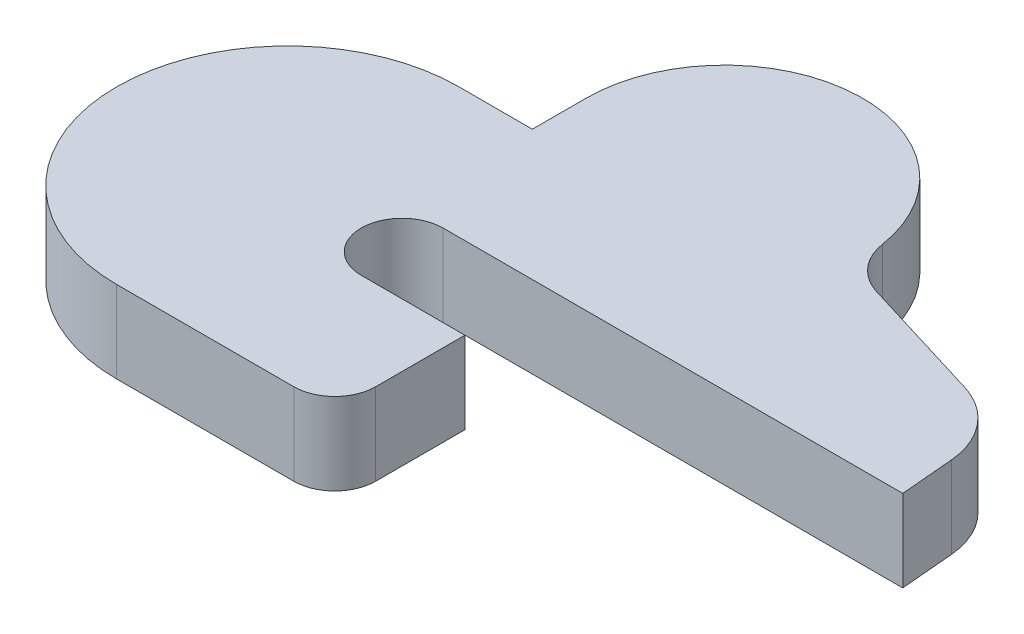
ISO-10303-21;
HEADER;
FILE_DESCRIPTION(('STEP AP214'),'2;1');
FILE_NAME('part.step','',(''),(''),'','','');
FILE_SCHEMA(('AUTOMOTIVE_DESIGN { 1 0 10303 214 1 1 1 1 }'));
ENDSEC;
DATA;
#1=APPLICATION_CONTEXT('core data for automotive mechanical design processes');
#2=APPLICATION_PROTOCOL_DEFINITION('international standard','automotive_design',2000,#1);
#3=PRODUCT_CONTEXT('',#1,'mechanical');
#4=PRODUCT('Part','Part','',(#3));
#5=PRODUCT_RELATED_PRODUCT_CATEGORY('part','',(#4));
#6=PRODUCT_DEFINITION_FORMATION('','',#4);
#7=PRODUCT_DEFINITION_CONTEXT('part definition',#1,'design');
#8=PRODUCT_DEFINITION('design','',#6,#7);
#9=PRODUCT_DEFINITION_SHAPE('','',#8);
#10=(LENGTH_UNIT() NAMED_UNIT(*) SI_UNIT(.MILLI.,.METRE.));
#11=(NAMED_UNIT(*) PLANE_ANGLE_UNIT() SI_UNIT($,.RADIAN.));
#12=(NAMED_UNIT(*) SI_UNIT($,.STERADIAN.) SOLID_ANGLE_UNIT());
#13=UNCERTAINTY_MEASURE_WITH_UNIT(LENGTH_MEASURE(1.E-05),#10,'distance_accuracy_value','');
#14=(GEOMETRIC_REPRESENTATION_CONTEXT(3) GLOBAL_UNCERTAINTY_ASSIGNED_CONTEXT((#13)) GLOBAL_UNIT_ASSIGNED_CONTEXT((#10,
#11,#12)) REPRESENTATION_CONTEXT('',''));
#15=CARTESIAN_POINT('',(0.,0.,0.));
#16=DIRECTION('',(0.,0.,1.));
#17=DIRECTION('',(1.,0.,0.));
#18=AXIS2_PLACEMENT_3D('',#15,#16,#17);
#19=CARTESIAN_POINT('',(0.,3.,3.27));
#20=DIRECTION('',(-1.,0.,0.));
#21=DIRECTION('',(0.,0.,1.));
#22=AXIS2_PLACEMENT_3D('',#19,#20,#21);
#23=PLANE('',#22);
#24=DIRECTION('',(0.,0.,-1.));
#25=VECTOR('',#24,1.);
#26=CARTESIAN_POINT('',(0.,0.,3.27));
#27=LINE('',#26,#25);
#28=CARTESIAN_POINT('',(0.,0.,3.27));
#29=VERTEX_POINT('',#28);
#30=CARTESIAN_POINT('',(0.,0.,0.));
#31=VERTEX_POINT('',#30);
#32=EDGE_CURVE('E165',#29,#31,#27,.T.);
#33=ORIENTED_EDGE('',*,*,#32,.T.);
#34=DIRECTION('',(0.,-1.,0.));
#35=VECTOR('',#34,1.);
#36=CARTESIAN_POINT('',(0.,3.,0.));
#37=LINE('',#36,#35);
#38=CARTESIAN_POINT('',(0.,3.,0.));
#39=VERTEX_POINT('',#38);
#40=EDGE_CURVE('E11',#39,#31,#37,.T.);
#41=ORIENTED_EDGE('',*,*,#40,.F.);
#42=DIRECTION('',(0.,0.,-1.));
#43=VECTOR('',#42,1.);
#44=CARTESIAN_POINT('',(0.,3.,3.27));
#45=LINE('',#44,#43);
#46=CARTESIAN_POINT('',(0.,3.,3.27));
#47=VERTEX_POINT('',#46);
#48=EDGE_CURVE('E191',#47,#39,#45,.T.);
#49=ORIENTED_EDGE('',*,*,#48,.F.);
#50=DIRECTION('',(0.,-1.,0.));
#51=VECTOR('',#50,1.);
#52=CARTESIAN_POINT('',(0.,3.,3.27));
#53=LINE('',#52,#51);
#54=EDGE_CURVE('E161',#47,#29,#53,.T.);
#55=ORIENTED_EDGE('',*,*,#54,.T.);
#56=EDGE_LOOP('',(#33,#41,#49,#55));
#57=FACE_BOUND('',#56,.T.);
#58=ADVANCED_FACE('F33',(#57),#23,.F.);
#59=CARTESIAN_POINT('',(0.,3.,0.));
#60=DIRECTION('',(0.,0.,1.));
#61=DIRECTION('',(1.,0.,0.));
#62=AXIS2_PLACEMENT_3D('',#59,#60,#61);
#63=PLANE('',#62);
#64=DIRECTION('',(-1.,0.,0.));
#65=VECTOR('',#64,1.);
#66=CARTESIAN_POINT('',(0.,0.,0.));
#67=LINE('',#66,#65);
#68=CARTESIAN_POINT('',(-3.8,0.,0.));
#69=VERTEX_POINT('',#68);
#70=EDGE_CURVE('E168',#31,#69,#67,.T.);
#71=ORIENTED_EDGE('',*,*,#70,.T.);
#72=DIRECTION('',(0.,-1.,0.));
#73=VECTOR('',#72,1.);
#74=CARTESIAN_POINT('',(-3.8,3.,0.));
#75=LINE('',#74,#73);
#76=CARTESIAN_POINT('',(-3.8,3.,0.));
#77=VERTEX_POINT('',#76);
#78=EDGE_CURVE('E41',#77,#69,#75,.T.);
#79=ORIENTED_EDGE('',*,*,#78,.F.);
#80=DIRECTION('',(-1.,0.,0.));
#81=VECTOR('',#80,1.);
#82=CARTESIAN_POINT('',(0.,3.,0.));
#83=LINE('',#82,#81);
#84=EDGE_CURVE('E110',#39,#77,#83,.T.);
#85=ORIENTED_EDGE('',*,*,#84,.F.);
#86=ORIENTED_EDGE('',*,*,#40,.T.);
#87=EDGE_LOOP('',(#71,#79,#85,#86));
#88=FACE_BOUND('',#87,.T.);
#89=ADVANCED_FACE('F279',(#88),#63,.F.);
#90=CARTESIAN_POINT('',(-3.8,3.,-1.5));
#91=DIRECTION('',(0.,-1.,0.));
#92=DIRECTION('',(0.,0.,-1.));
#93=AXIS2_PLACEMENT_3D('',#90,#91,#92);
#94=CYLINDRICAL_SURFACE('',#93,1.5);
#95=CARTESIAN_POINT('',(-3.8,0.,-1.5));
#96=DIRECTION('',(0.,-1.,0.));
#97=DIRECTION('',(0.,0.,-1.));
#98=AXIS2_PLACEMENT_3D('',#95,#96,#97);
#99=CIRCLE('',#98,1.5);
#100=CARTESIAN_POINT('',(-3.8,0.,-3.));
#101=VERTEX_POINT('',#100);
#102=EDGE_CURVE('E170',#69,#101,#99,.T.);
#103=ORIENTED_EDGE('',*,*,#102,.T.);
#104=DIRECTION('',(0.,-1.,0.));
#105=VECTOR('',#104,1.);
#106=CARTESIAN_POINT('',(-3.8,3.,-3.));
#107=LINE('',#106,#105);
#108=CARTESIAN_POINT('',(-3.8,3.,-3.));
#109=VERTEX_POINT('',#108);
#110=EDGE_CURVE('E216',#109,#101,#107,.T.);
#111=ORIENTED_EDGE('',*,*,#110,.F.);
#112=CARTESIAN_POINT('',(-3.8,3.,-1.5));
#113=DIRECTION('',(0.,-1.,0.));
#114=DIRECTION('',(0.,0.,-1.));
#115=AXIS2_PLACEMENT_3D('',#112,#113,#114);
#116=CIRCLE('',#115,1.5);
#117=EDGE_CURVE('E224',#77,#109,#116,.T.);
#118=ORIENTED_EDGE('',*,*,#117,.F.);
#119=ORIENTED_EDGE('',*,*,#78,.T.);
#120=EDGE_LOOP('',(#103,#111,#118,#119));
#121=FACE_BOUND('',#120,.T.);
#122=ADVANCED_FACE('F222',(#121),#94,.F.);
#123=CARTESIAN_POINT('',(-3.8,3.,-3.));
#124=DIRECTION('',(0.,0.,-1.));
#125=DIRECTION('',(-1.,0.,0.));
#126=AXIS2_PLACEMENT_3D('',#123,#124,#125);
#127=PLANE('',#126);
#128=DIRECTION('',(1.,0.,0.));
#129=VECTOR('',#128,1.);
#130=CARTESIAN_POINT('',(-3.8,0.,-3.));
#131=LINE('',#130,#129);
#132=CARTESIAN_POINT('',(13.04,0.,-3.));
#133=VERTEX_POINT('',#132);
#134=EDGE_CURVE('E172',#101,#133,#131,.T.);
#135=ORIENTED_EDGE('',*,*,#134,.T.);
#136=DIRECTION('',(0.,-1.,0.));
#137=VECTOR('',#136,1.);
#138=CARTESIAN_POINT('',(13.04,3.,-3.));
#139=LINE('',#138,#137);
#140=CARTESIAN_POINT('',(13.04,3.,-3.));
#141=VERTEX_POINT('',#140);
#142=EDGE_CURVE('E213',#141,#133,#139,.T.);
#143=ORIENTED_EDGE('',*,*,#142,.F.);
#144=DIRECTION('',(1.,0.,0.));
#145=VECTOR('',#144,1.);
#146=CARTESIAN_POINT('',(-3.8,3.,-3.));
#147=LINE('',#146,#145);
#148=EDGE_CURVE('E242',#109,#141,#147,.T.);
#149=ORIENTED_EDGE('',*,*,#148,.F.);
#150=ORIENTED_EDGE('',*,*,#110,.T.);
#151=EDGE_LOOP('',(#135,#143,#149,#150));
#152=FACE_BOUND('',#151,.T.);
#153=ADVANCED_FACE('F233',(#152),#127,.F.);
#154=CARTESIAN_POINT('',(13.04,3.,-3.));
#155=DIRECTION('',(-0.996194698091745,0.,0.0871557427476616));
#156=DIRECTION('',(0.0871557427476616,0.,0.996194698091745));
#157=AXIS2_PLACEMENT_3D('',#154,#155,#156);
#158=PLANE('',#157);
#159=DIRECTION('',(-0.0871557427476616,0.,-0.996194698091745));
#160=VECTOR('',#159,1.);
#161=CARTESIAN_POINT('',(13.04,0.,-3.));
#162=LINE('',#161,#160);
#163=CARTESIAN_POINT('',(12.8682548789584,0.,-4.96305571624992));
#164=VERTEX_POINT('',#163);
#165=EDGE_CURVE('E174',#133,#164,#162,.T.);
#166=ORIENTED_EDGE('',*,*,#165,.T.);
#167=DIRECTION('',(0.,-1.,0.));
#168=VECTOR('',#167,1.);
#169=CARTESIAN_POINT('',(12.8682548789584,3.,-4.96305571624992));
#170=LINE('',#169,#168);
#171=CARTESIAN_POINT('',(12.8682548789584,3.,-4.96305571624992));
#172=VERTEX_POINT('',#171);
#173=EDGE_CURVE('E210',#172,#164,#170,.T.);
#174=ORIENTED_EDGE('',*,*,#173,.F.);
#175=DIRECTION('',(-0.0871557427476616,0.,-0.996194698091745));
#176=VECTOR('',#175,1.);
#177=CARTESIAN_POINT('',(13.04,3.,-3.));
#178=LINE('',#177,#176);
#179=EDGE_CURVE('E239',#141,#172,#178,.T.);
#180=ORIENTED_EDGE('',*,*,#179,.F.);
#181=ORIENTED_EDGE('',*,*,#142,.T.);
#182=EDGE_LOOP('',(#166,#174,#180,#181));
#183=FACE_BOUND('',#182,.T.);
#184=ADVANCED_FACE('F237',(#183),#158,.F.);
#185=CARTESIAN_POINT('',(9.96047910472558,3.,-4.70865829992922));
#186=DIRECTION('',(0.,-1.,0.));
#187=DIRECTION('',(0.,0.,-1.));
#188=AXIS2_PLACEMENT_3D('',#185,#186,#187);
#189=CYLINDRICAL_SURFACE('',#188,2.91888300530283);
#190=CARTESIAN_POINT('',(9.96047910472558,0.,-4.70865829992922));
#191=DIRECTION('',(0.,1.,0.));
#192=DIRECTION('',(0.,0.,1.));
#193=AXIS2_PLACEMENT_3D('',#190,#191,#192);
#194=CIRCLE('',#193,2.91888300530283);
#195=CARTESIAN_POINT('',(10.8138779048722,0.,-7.5));
#196=VERTEX_POINT('',#195);
#197=EDGE_CURVE('E176',#164,#196,#194,.T.);
#198=ORIENTED_EDGE('',*,*,#197,.T.);
#199=DIRECTION('',(0.,-1.,0.));
#200=VECTOR('',#199,1.);
#201=CARTESIAN_POINT('',(10.8138779048722,3.,-7.5));
#202=LINE('',#201,#200);
#203=CARTESIAN_POINT('',(10.8138779048722,3.,-7.5));
#204=VERTEX_POINT('',#203);
#205=EDGE_CURVE('E207',#204,#196,#202,.T.);
#206=ORIENTED_EDGE('',*,*,#205,.F.);
#207=CARTESIAN_POINT('',(9.96047910472558,3.,-4.70865829992922));
#208=DIRECTION('',(0.,1.,0.));
#209=DIRECTION('',(0.,0.,1.));
#210=AXIS2_PLACEMENT_3D('',#207,#208,#209);
#211=CIRCLE('',#210,2.91888300530283);
#212=EDGE_CURVE('E241',#172,#204,#211,.T.);
#213=ORIENTED_EDGE('',*,*,#212,.F.);
#214=ORIENTED_EDGE('',*,*,#173,.T.);
#215=EDGE_LOOP('',(#198,#206,#213,#214));
#216=FACE_BOUND('',#215,.T.);
#217=ADVANCED_FACE('F292',(#216),#189,.T.);
#218=CARTESIAN_POINT('',(6.1562997085304,3.,-8.92396455591458));
#219=DIRECTION('',(-0.292371704722737,0.,0.956304755963035));
#220=DIRECTION('',(0.956304755963036,0.,0.292371704722737));
#221=AXIS2_PLACEMENT_3D('',#218,#219,#220);
#222=PLANE('',#221);
#223=DIRECTION('',(-0.956304755963035,0.,-0.292371704722737));
#224=VECTOR('',#223,1.);
#225=CARTESIAN_POINT('',(6.1562997085304,0.,-8.92396455591458));
#226=LINE('',#225,#224);
#227=CARTESIAN_POINT('',(6.1562997085304,0.,-8.92396455591458));
#228=VERTEX_POINT('',#227);
#229=EDGE_CURVE('E178',#196,#228,#226,.T.);
#230=ORIENTED_EDGE('',*,*,#229,.T.);
#231=DIRECTION('',(0.,-1.,0.));
#232=VECTOR('',#231,1.);
#233=CARTESIAN_POINT('',(6.1562997085304,3.,-8.92396455591458));
#234=LINE('',#233,#232);
#235=CARTESIAN_POINT('',(6.1562997085304,3.,-8.92396455591458));
#236=VERTEX_POINT('',#235);
#237=EDGE_CURVE('E204',#236,#228,#234,.T.);
#238=ORIENTED_EDGE('',*,*,#237,.F.);
#239=DIRECTION('',(-0.956304755963035,0.,-0.292371704722737));
#240=VECTOR('',#239,1.);
#241=CARTESIAN_POINT('',(6.1562997085304,3.,-8.92396455591458));
#242=LINE('',#241,#240);
#243=EDGE_CURVE('E244',#204,#236,#242,.T.);
#244=ORIENTED_EDGE('',*,*,#243,.F.);
#245=ORIENTED_EDGE('',*,*,#205,.T.);
#246=EDGE_LOOP('',(#230,#238,#244,#245));
#247=FACE_BOUND('',#246,.T.);
#248=ADVANCED_FACE('F295',(#247),#222,.F.);
#249=CARTESIAN_POINT('',(6.74104311797588,3.,-10.8365740678406));
#250=DIRECTION('',(0.,-1.,0.));
#251=DIRECTION('',(0.,0.,-1.));
#252=AXIS2_PLACEMENT_3D('',#249,#250,#251);
#253=CYLINDRICAL_SURFACE('',#252,2.);
#254=CARTESIAN_POINT('',(6.74104311797588,0.,-10.8365740678406));
#255=DIRECTION('',(0.,-1.,0.));
#256=DIRECTION('',(0.,0.,1.));
#257=AXIS2_PLACEMENT_3D('',#254,#255,#256);
#258=CIRCLE('',#257,2.);
#259=CARTESIAN_POINT('',(4.76519844768279,0.,-10.5266743439389));
#260=VERTEX_POINT('',#259);
#261=EDGE_CURVE('E180',#228,#260,#258,.T.);
#262=ORIENTED_EDGE('',*,*,#261,.T.);
#263=DIRECTION('',(0.,-1.,0.));
#264=VECTOR('',#263,1.);
#265=CARTESIAN_POINT('',(4.76519844768279,3.,-10.5266743439389));
#266=LINE('',#265,#264);
#267=CARTESIAN_POINT('',(4.76519844768279,3.,-10.5266743439389));
#268=VERTEX_POINT('',#267);
#269=EDGE_CURVE('E201',#268,#260,#266,.T.);
#270=ORIENTED_EDGE('',*,*,#269,.F.);
#271=CARTESIAN_POINT('',(6.74104311797588,3.,-10.8365740678406));
#272=DIRECTION('',(0.,-1.,0.));
#273=DIRECTION('',(0.,0.,1.));
#274=AXIS2_PLACEMENT_3D('',#271,#272,#273);
#275=CIRCLE('',#274,2.);
#276=EDGE_CURVE('E250',#236,#268,#275,.T.);
#277=ORIENTED_EDGE('',*,*,#276,.F.);
#278=ORIENTED_EDGE('',*,*,#237,.T.);
#279=EDGE_LOOP('',(#262,#270,#277,#278));
#280=FACE_BOUND('',#279,.T.);
#281=ADVANCED_FACE('F299',(#280),#253,.F.);
#282=CARTESIAN_POINT('',(-0.236825111459487,3.,-9.74213609392624));
#283=DIRECTION('',(0.,-1.,0.));
#284=DIRECTION('',(0.,0.,-1.));
#285=AXIS2_PLACEMENT_3D('',#282,#283,#284);
#286=CYLINDRICAL_SURFACE('',#285,5.06317488854051);
#287=CARTESIAN_POINT('',(-0.236825111459487,0.,-9.74213609392624));
#288=DIRECTION('',(0.,1.,0.));
#289=DIRECTION('',(0.,0.,-1.));
#290=AXIS2_PLACEMENT_3D('',#287,#288,#289);
#291=CIRCLE('',#290,5.06317488854051);
#292=CARTESIAN_POINT('',(-5.3,0.,-9.74213609392624));
#293=VERTEX_POINT('',#292);
#294=EDGE_CURVE('E182',#260,#293,#291,.T.);
#295=ORIENTED_EDGE('',*,*,#294,.T.);
#296=DIRECTION('',(0.,-1.,0.));
#297=VECTOR('',#296,1.);
#298=CARTESIAN_POINT('',(-5.3,3.,-9.74213609392624));
#299=LINE('',#298,#297);
#300=CARTESIAN_POINT('',(-5.3,3.,-9.74213609392624));
#301=VERTEX_POINT('',#300);
#302=EDGE_CURVE('E198',#301,#293,#299,.T.);
#303=ORIENTED_EDGE('',*,*,#302,.F.);
#304=CARTESIAN_POINT('',(-0.236825111459487,3.,-9.74213609392624));
#305=DIRECTION('',(0.,1.,0.));
#306=DIRECTION('',(0.,0.,-1.));
#307=AXIS2_PLACEMENT_3D('',#304,#305,#306);
#308=CIRCLE('',#307,5.06317488854051);
#309=EDGE_CURVE('E252',#268,#301,#308,.T.);
#310=ORIENTED_EDGE('',*,*,#309,.F.);
#311=ORIENTED_EDGE('',*,*,#269,.T.);
#312=EDGE_LOOP('',(#295,#303,#310,#311));
#313=FACE_BOUND('',#312,.T.);
#314=ADVANCED_FACE('F303',(#313),#286,.T.);
#315=CARTESIAN_POINT('',(-5.3,3.,-9.74213609392624));
#316=DIRECTION('',(1.,0.,0.));
#317=DIRECTION('',(0.,0.,-1.));
#318=AXIS2_PLACEMENT_3D('',#315,#316,#317);
#319=PLANE('',#318);
#320=DIRECTION('',(0.,0.,1.));
#321=VECTOR('',#320,1.);
#322=CARTESIAN_POINT('',(-5.3,0.,-9.74213609392624));
#323=LINE('',#322,#321);
#324=CARTESIAN_POINT('',(-5.3,0.,-7.77));
#325=VERTEX_POINT('',#324);
#326=EDGE_CURVE('E184',#293,#325,#323,.T.);
#327=ORIENTED_EDGE('',*,*,#326,.T.);
#328=DIRECTION('',(0.,-1.,0.));
#329=VECTOR('',#328,1.);
#330=CARTESIAN_POINT('',(-5.3,3.,-7.77));
#331=LINE('',#330,#329);
#332=CARTESIAN_POINT('',(-5.3,3.,-7.77));
#333=VERTEX_POINT('',#332);
#334=EDGE_CURVE('E195',#333,#325,#331,.T.);
#335=ORIENTED_EDGE('',*,*,#334,.F.);
#336=DIRECTION('',(0.,0.,1.));
#337=VECTOR('',#336,1.);
#338=CARTESIAN_POINT('',(-5.3,3.,-9.74213609392624));
#339=LINE('',#338,#337);
#340=EDGE_CURVE('E254',#301,#333,#339,.T.);
#341=ORIENTED_EDGE('',*,*,#340,.F.);
#342=ORIENTED_EDGE('',*,*,#302,.T.);
#343=EDGE_LOOP('',(#327,#335,#341,#342));
#344=FACE_BOUND('',#343,.T.);
#345=ADVANCED_FACE('F260',(#344),#319,.F.);
#346=CARTESIAN_POINT('',(-5.3,3.,-7.77));
#347=DIRECTION('',(0.,0.,1.));
#348=DIRECTION('',(1.,0.,0.));
#349=AXIS2_PLACEMENT_3D('',#346,#347,#348);
#350=PLANE('',#349);
#351=DIRECTION('',(-1.,0.,0.));
#352=VECTOR('',#351,1.);
#353=CARTESIAN_POINT('',(-5.3,0.,-7.77));
#354=LINE('',#353,#352);
#355=CARTESIAN_POINT('',(-7.99,0.,-7.77));
#356=VERTEX_POINT('',#355);
#357=EDGE_CURVE('E186',#325,#356,#354,.T.);
#358=ORIENTED_EDGE('',*,*,#357,.T.);
#359=DIRECTION('',(0.,-1.,0.));
#360=VECTOR('',#359,1.);
#361=CARTESIAN_POINT('',(-7.99,3.,-7.77));
#362=LINE('',#361,#360);
#363=CARTESIAN_POINT('',(-7.99,3.,-7.77));
#364=VERTEX_POINT('',#363);
#365=EDGE_CURVE('E156',#364,#356,#362,.T.);
#366=ORIENTED_EDGE('',*,*,#365,.F.);
#367=DIRECTION('',(-1.,0.,0.));
#368=VECTOR('',#367,1.);
#369=CARTESIAN_POINT('',(-5.3,3.,-7.77));
#370=LINE('',#369,#368);
#371=EDGE_CURVE('E147',#333,#364,#370,.T.);
#372=ORIENTED_EDGE('',*,*,#371,.F.);
#373=ORIENTED_EDGE('',*,*,#334,.T.);
#374=EDGE_LOOP('',(#358,#366,#372,#373));
#375=FACE_BOUND('',#374,.T.);
#376=ADVANCED_FACE('F264',(#375),#350,.F.);
#377=CARTESIAN_POINT('',(-7.99,3.,-1.5));
#378=DIRECTION('',(0.,-1.,0.));
#379=DIRECTION('',(0.,0.,-1.));
#380=AXIS2_PLACEMENT_3D('',#377,#378,#379);
#381=CYLINDRICAL_SURFACE('',#380,6.27);
#382=CARTESIAN_POINT('',(-7.99,0.,-1.5));
#383=DIRECTION('',(0.,1.,0.));
#384=DIRECTION('',(0.,0.,1.));
#385=AXIS2_PLACEMENT_3D('',#382,#383,#384);
#386=CIRCLE('',#385,6.27);
#387=CARTESIAN_POINT('',(-7.99,0.,4.77));
#388=VERTEX_POINT('',#387);
#389=EDGE_CURVE('E155',#356,#388,#386,.T.);
#390=ORIENTED_EDGE('',*,*,#389,.T.);
#391=DIRECTION('',(0.,-1.,0.));
#392=VECTOR('',#391,1.);
#393=CARTESIAN_POINT('',(-7.99,3.,4.77));
#394=LINE('',#393,#392);
#395=CARTESIAN_POINT('',(-7.99,3.,4.77));
#396=VERTEX_POINT('',#395);
#397=EDGE_CURVE('E152',#396,#388,#394,.T.);
#398=ORIENTED_EDGE('',*,*,#397,.F.);
#399=CARTESIAN_POINT('',(-7.99,3.,-1.5));
#400=DIRECTION('',(0.,1.,0.));
#401=DIRECTION('',(0.,0.,1.));
#402=AXIS2_PLACEMENT_3D('',#399,#400,#401);
#403=CIRCLE('',#402,6.27);
#404=EDGE_CURVE('E141',#364,#396,#403,.T.);
#405=ORIENTED_EDGE('',*,*,#404,.F.);
#406=ORIENTED_EDGE('',*,*,#365,.T.);
#407=EDGE_LOOP('',(#390,#398,#405,#406));
#408=FACE_BOUND('',#407,.T.);
#409=ADVANCED_FACE('F153',(#408),#381,.T.);
#410=CARTESIAN_POINT('',(-7.99,3.,4.77));
#411=DIRECTION('',(0.,0.,-1.));
#412=DIRECTION('',(-1.,0.,0.));
#413=AXIS2_PLACEMENT_3D('',#410,#411,#412);
#414=PLANE('',#413);
#415=DIRECTION('',(1.,0.,0.));
#416=VECTOR('',#415,1.);
#417=CARTESIAN_POINT('',(-7.99,0.,4.77));
#418=LINE('',#417,#416);
#419=CARTESIAN_POINT('',(-1.5,0.,4.77));
#420=VERTEX_POINT('',#419);
#421=EDGE_CURVE('E96',#388,#420,#418,.T.);
#422=ORIENTED_EDGE('',*,*,#421,.T.);
#423=DIRECTION('',(0.,-1.,0.));
#424=VECTOR('',#423,1.);
#425=CARTESIAN_POINT('',(-1.5,3.,4.77));
#426=LINE('',#425,#424);
#427=CARTESIAN_POINT('',(-1.5,3.,4.77));
#428=VERTEX_POINT('',#427);
#429=EDGE_CURVE('E157',#428,#420,#426,.T.);
#430=ORIENTED_EDGE('',*,*,#429,.F.);
#431=DIRECTION('',(1.,0.,0.));
#432=VECTOR('',#431,1.);
#433=CARTESIAN_POINT('',(-7.99,3.,4.77));
#434=LINE('',#433,#432);
#435=EDGE_CURVE('E145',#396,#428,#434,.T.);
#436=ORIENTED_EDGE('',*,*,#435,.F.);
#437=ORIENTED_EDGE('',*,*,#397,.T.);
#438=EDGE_LOOP('',(#422,#430,#436,#437));
#439=FACE_BOUND('',#438,.T.);
#440=ADVANCED_FACE('F159',(#439),#414,.F.);
#441=CARTESIAN_POINT('',(-1.5,3.,3.27));
#442=DIRECTION('',(0.,-1.,0.));
#443=DIRECTION('',(0.,0.,-1.));
#444=AXIS2_PLACEMENT_3D('',#441,#442,#443);
#445=CYLINDRICAL_SURFACE('',#444,1.5);
#446=CARTESIAN_POINT('',(-1.5,0.,3.27));
#447=DIRECTION('',(0.,1.,0.));
#448=DIRECTION('',(0.,0.,1.));
#449=AXIS2_PLACEMENT_3D('',#446,#447,#448);
#450=CIRCLE('',#449,1.5);
#451=EDGE_CURVE('E102',#420,#29,#450,.T.);
#452=ORIENTED_EDGE('',*,*,#451,.T.);
#453=ORIENTED_EDGE('',*,*,#54,.F.);
#454=CARTESIAN_POINT('',(-1.5,3.,3.27));
#455=DIRECTION('',(0.,1.,0.));
#456=DIRECTION('',(0.,0.,1.));
#457=AXIS2_PLACEMENT_3D('',#454,#455,#456);
#458=CIRCLE('',#457,1.5);
#459=EDGE_CURVE('E49',#428,#47,#458,.T.);
#460=ORIENTED_EDGE('',*,*,#459,.F.);
#461=ORIENTED_EDGE('',*,*,#429,.T.);
#462=EDGE_LOOP('',(#452,#453,#460,#461));
#463=FACE_BOUND('',#462,.T.);
#464=ADVANCED_FACE('F268',(#463),#445,.T.);
#465=CARTESIAN_POINT('',(-3.8,3.,-1.5));
#466=DIRECTION('',(0.,-1.,0.));
#467=DIRECTION('',(0.,0.,-1.));
#468=AXIS2_PLACEMENT_3D('',#465,#466,#467);
#469=PLANE('',#468);
#470=ORIENTED_EDGE('',*,*,#48,.T.);
#471=ORIENTED_EDGE('',*,*,#84,.T.);
#472=ORIENTED_EDGE('',*,*,#117,.T.);
#473=ORIENTED_EDGE('',*,*,#148,.T.);
#474=ORIENTED_EDGE('',*,*,#179,.T.);
#475=ORIENTED_EDGE('',*,*,#212,.T.);
#476=ORIENTED_EDGE('',*,*,#243,.T.);
#477=ORIENTED_EDGE('',*,*,#276,.T.);
#478=ORIENTED_EDGE('',*,*,#309,.T.);
#479=ORIENTED_EDGE('',*,*,#340,.T.);
#480=ORIENTED_EDGE('',*,*,#371,.T.);
#481=ORIENTED_EDGE('',*,*,#404,.T.);
#482=ORIENTED_EDGE('',*,*,#435,.T.);
#483=ORIENTED_EDGE('',*,*,#459,.T.);
#484=EDGE_LOOP('',(#470,#471,#472,#473,#474,#475,#476,#477,#478,#479,#480,#481,#482,#483));
#485=FACE_BOUND('',#484,.T.);
#486=ADVANCED_FACE('F143',(#485),#469,.F.);
#487=CARTESIAN_POINT('',(-3.8,0.,-1.5));
#488=DIRECTION('',(0.,-1.,0.));
#489=DIRECTION('',(0.,0.,-1.));
#490=AXIS2_PLACEMENT_3D('',#487,#488,#489);
#491=PLANE('',#490);
#492=ORIENTED_EDGE('',*,*,#32,.F.);
#493=ORIENTED_EDGE('',*,*,#451,.F.);
#494=ORIENTED_EDGE('',*,*,#421,.F.);
#495=ORIENTED_EDGE('',*,*,#389,.F.);
#496=ORIENTED_EDGE('',*,*,#357,.F.);
#497=ORIENTED_EDGE('',*,*,#326,.F.);
#498=ORIENTED_EDGE('',*,*,#294,.F.);
#499=ORIENTED_EDGE('',*,*,#261,.F.);
#500=ORIENTED_EDGE('',*,*,#229,.F.);
#501=ORIENTED_EDGE('',*,*,#197,.F.);
#502=ORIENTED_EDGE('',*,*,#165,.F.);
#503=ORIENTED_EDGE('',*,*,#134,.F.);
#504=ORIENTED_EDGE('',*,*,#102,.F.);
#505=ORIENTED_EDGE('',*,*,#70,.F.);
#506=EDGE_LOOP('',(#492,#493,#494,#495,#496,#497,#498,#499,#500,#501,#502,#503,#504,#505));
#507=FACE_BOUND('',#506,.T.);
#508=ADVANCED_FACE('F228',(#507),#491,.T.);
#509=CLOSED_SHELL('',(#58,#89,#122,#153,#184,#217,#248,#281,#314,#345,#376,#409,#440,#464,#486,#508));
#510=MANIFOLD_SOLID_BREP('B2',#509);
#511=ADVANCED_BREP_SHAPE_REPRESENTATION('',(#18,#510),#14);
#512=SHAPE_DEFINITION_REPRESENTATION(#9,#511);
ENDSEC;
END-ISO-10303-21;
